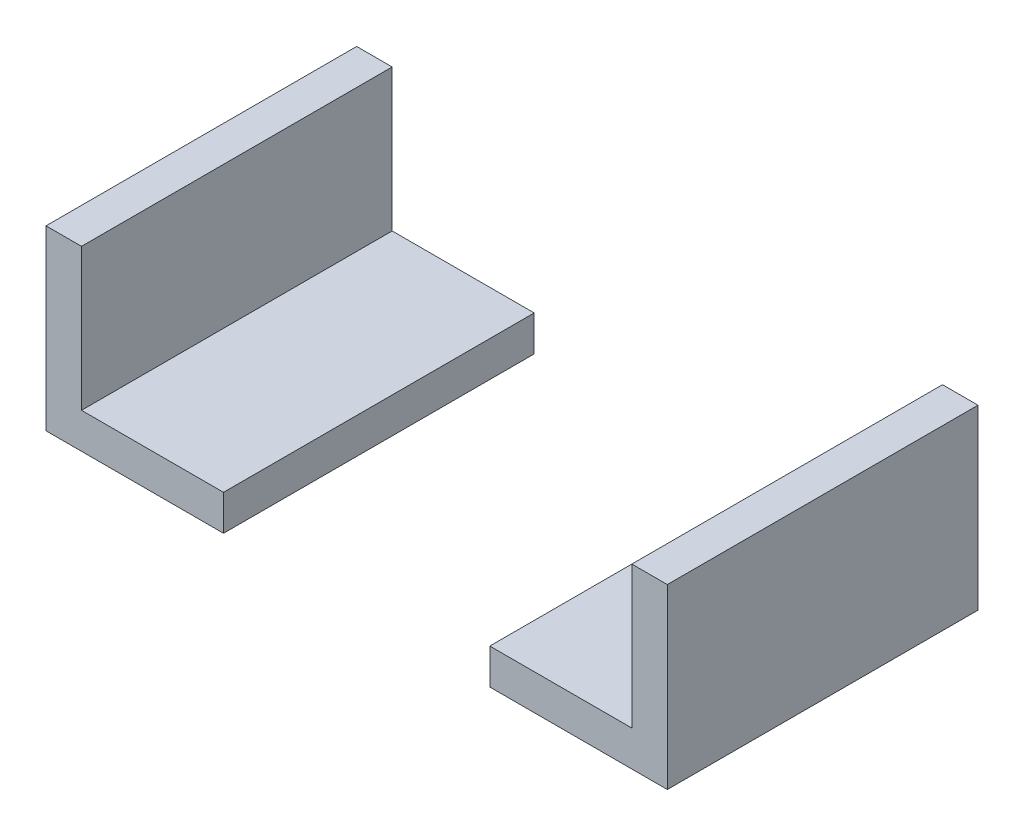
ISO-10303-21;
HEADER;
FILE_DESCRIPTION(('STEP AP214'),'2;1');
FILE_NAME('part.step','',(''),(''),'','','');
FILE_SCHEMA(('AUTOMOTIVE_DESIGN { 1 0 10303 214 1 1 1 1 }'));
ENDSEC;
DATA;
#1=APPLICATION_CONTEXT('core data for automotive mechanical design processes');
#2=APPLICATION_PROTOCOL_DEFINITION('international standard','automotive_design',2000,#1);
#3=PRODUCT_CONTEXT('',#1,'mechanical');
#4=PRODUCT('Part','Part','',(#3));
#5=PRODUCT_RELATED_PRODUCT_CATEGORY('part','',(#4));
#6=PRODUCT_DEFINITION_FORMATION('','',#4);
#7=PRODUCT_DEFINITION_CONTEXT('part definition',#1,'design');
#8=PRODUCT_DEFINITION('design','',#6,#7);
#9=PRODUCT_DEFINITION_SHAPE('','',#8);
#10=(LENGTH_UNIT() NAMED_UNIT(*) SI_UNIT(.MILLI.,.METRE.));
#11=(NAMED_UNIT(*) PLANE_ANGLE_UNIT() SI_UNIT($,.RADIAN.));
#12=(NAMED_UNIT(*) SI_UNIT($,.STERADIAN.) SOLID_ANGLE_UNIT());
#13=UNCERTAINTY_MEASURE_WITH_UNIT(LENGTH_MEASURE(1.E-05),#10,'distance_accuracy_value','');
#14=(GEOMETRIC_REPRESENTATION_CONTEXT(3) GLOBAL_UNCERTAINTY_ASSIGNED_CONTEXT((#13)) GLOBAL_UNIT_ASSIGNED_CONTEXT((#10,
#11,#12)) REPRESENTATION_CONTEXT('',''));
#15=CARTESIAN_POINT('',(0.,0.,0.));
#16=DIRECTION('',(0.,0.,1.));
#17=DIRECTION('',(1.,0.,0.));
#18=AXIS2_PLACEMENT_3D('',#15,#16,#17);
#19=CARTESIAN_POINT('',(89.5823182173414,-16.8988864998088,70.));
#20=DIRECTION('',(0.,1.,0.));
#21=DIRECTION('',(0.,0.,1.));
#22=AXIS2_PLACEMENT_3D('',#19,#20,#21);
#23=PLANE('',#22);
#24=DIRECTION('',(1.,0.,0.));
#25=VECTOR('',#24,1.);
#26=CARTESIAN_POINT('',(89.5823182173414,-16.8988864998088,0.));
#27=LINE('',#26,#25);
#28=CARTESIAN_POINT('',(89.5823182173414,-16.8988864998088,0.));
#29=VERTEX_POINT('',#28);
#30=CARTESIAN_POINT('',(129.582318217341,-16.8988864998088,0.));
#31=VERTEX_POINT('',#30);
#32=EDGE_CURVE('E12',#29,#31,#27,.T.);
#33=ORIENTED_EDGE('',*,*,#32,.T.);
#34=DIRECTION('',(0.,0.,-1.));
#35=VECTOR('',#34,1.);
#36=CARTESIAN_POINT('',(129.582318217341,-16.8988864998088,70.));
#37=LINE('',#36,#35);
#38=CARTESIAN_POINT('',(129.582318217341,-16.8988864998088,70.));
#39=VERTEX_POINT('',#38);
#40=EDGE_CURVE('E151',#39,#31,#37,.T.);
#41=ORIENTED_EDGE('',*,*,#40,.F.);
#42=DIRECTION('',(1.,0.,0.));
#43=VECTOR('',#42,1.);
#44=CARTESIAN_POINT('',(89.5823182173414,-16.8988864998088,70.));
#45=LINE('',#44,#43);
#46=CARTESIAN_POINT('',(89.5823182173414,-16.8988864998088,70.));
#47=VERTEX_POINT('',#46);
#48=EDGE_CURVE('E53',#47,#39,#45,.T.);
#49=ORIENTED_EDGE('',*,*,#48,.F.);
#50=DIRECTION('',(0.,0.,-1.));
#51=VECTOR('',#50,1.);
#52=CARTESIAN_POINT('',(89.5823182173414,-16.8988864998088,70.));
#53=LINE('',#52,#51);
#54=EDGE_CURVE('E139',#47,#29,#53,.T.);
#55=ORIENTED_EDGE('',*,*,#54,.T.);
#56=EDGE_LOOP('',(#33,#41,#49,#55));
#57=FACE_BOUND('',#56,.T.);
#58=ADVANCED_FACE('F49',(#57),#23,.F.);
#59=CARTESIAN_POINT('',(129.582318217341,-16.8988864998088,70.));
#60=DIRECTION('',(-1.,0.,0.));
#61=DIRECTION('',(0.,0.,1.));
#62=AXIS2_PLACEMENT_3D('',#59,#60,#61);
#63=PLANE('',#62);
#64=DIRECTION('',(0.,1.,0.));
#65=VECTOR('',#64,1.);
#66=CARTESIAN_POINT('',(129.582318217341,-16.8988864998088,0.));
#67=LINE('',#66,#65);
#68=CARTESIAN_POINT('',(129.582318217341,23.1011135001912,0.));
#69=VERTEX_POINT('',#68);
#70=EDGE_CURVE('E59',#31,#69,#67,.T.);
#71=ORIENTED_EDGE('',*,*,#70,.T.);
#72=DIRECTION('',(0.,0.,-1.));
#73=VECTOR('',#72,1.);
#74=CARTESIAN_POINT('',(129.582318217341,23.1011135001912,70.));
#75=LINE('',#74,#73);
#76=CARTESIAN_POINT('',(129.582318217341,23.1011135001912,70.));
#77=VERTEX_POINT('',#76);
#78=EDGE_CURVE('E117',#77,#69,#75,.T.);
#79=ORIENTED_EDGE('',*,*,#78,.F.);
#80=DIRECTION('',(0.,1.,0.));
#81=VECTOR('',#80,1.);
#82=CARTESIAN_POINT('',(129.582318217341,-16.8988864998088,70.));
#83=LINE('',#82,#81);
#84=EDGE_CURVE('E89',#39,#77,#83,.T.);
#85=ORIENTED_EDGE('',*,*,#84,.F.);
#86=ORIENTED_EDGE('',*,*,#40,.T.);
#87=EDGE_LOOP('',(#71,#79,#85,#86));
#88=FACE_BOUND('',#87,.T.);
#89=ADVANCED_FACE('F190',(#88),#63,.F.);
#90=CARTESIAN_POINT('',(129.582318217341,23.1011135001912,70.));
#91=DIRECTION('',(0.,-1.,0.));
#92=DIRECTION('',(0.,0.,-1.));
#93=AXIS2_PLACEMENT_3D('',#90,#91,#92);
#94=PLANE('',#93);
#95=DIRECTION('',(-1.,0.,0.));
#96=VECTOR('',#95,1.);
#97=CARTESIAN_POINT('',(129.582318217341,23.1011135001912,0.));
#98=LINE('',#97,#96);
#99=CARTESIAN_POINT('',(121.582318217341,23.1011135001912,0.));
#100=VERTEX_POINT('',#99);
#101=EDGE_CURVE('E111',#69,#100,#98,.T.);
#102=ORIENTED_EDGE('',*,*,#101,.T.);
#103=DIRECTION('',(0.,0.,-1.));
#104=VECTOR('',#103,1.);
#105=CARTESIAN_POINT('',(121.582318217341,23.1011135001912,70.));
#106=LINE('',#105,#104);
#107=CARTESIAN_POINT('',(121.582318217341,23.1011135001912,70.));
#108=VERTEX_POINT('',#107);
#109=EDGE_CURVE('E115',#108,#100,#106,.T.);
#110=ORIENTED_EDGE('',*,*,#109,.F.);
#111=DIRECTION('',(-1.,0.,0.));
#112=VECTOR('',#111,1.);
#113=CARTESIAN_POINT('',(129.582318217341,23.1011135001912,70.));
#114=LINE('',#113,#112);
#115=EDGE_CURVE('E142',#77,#108,#114,.T.);
#116=ORIENTED_EDGE('',*,*,#115,.F.);
#117=ORIENTED_EDGE('',*,*,#78,.T.);
#118=EDGE_LOOP('',(#102,#110,#116,#117));
#119=FACE_BOUND('',#118,.T.);
#120=ADVANCED_FACE('F113',(#119),#94,.F.);
#121=CARTESIAN_POINT('',(121.582318217341,23.1011135001912,70.));
#122=DIRECTION('',(1.,0.,0.));
#123=DIRECTION('',(0.,1.,0.));
#124=AXIS2_PLACEMENT_3D('',#121,#122,#123);
#125=PLANE('',#124);
#126=DIRECTION('',(0.,-1.,0.));
#127=VECTOR('',#126,1.);
#128=CARTESIAN_POINT('',(121.582318217341,23.1011135001912,0.));
#129=LINE('',#128,#127);
#130=CARTESIAN_POINT('',(121.582318217341,-8.89888649980875,0.));
#131=VERTEX_POINT('',#130);
#132=EDGE_CURVE('E119',#100,#131,#129,.T.);
#133=ORIENTED_EDGE('',*,*,#132,.T.);
#134=DIRECTION('',(0.,0.,-1.));
#135=VECTOR('',#134,1.);
#136=CARTESIAN_POINT('',(121.582318217341,-8.89888649980875,70.));
#137=LINE('',#136,#135);
#138=CARTESIAN_POINT('',(121.582318217341,-8.89888649980875,70.));
#139=VERTEX_POINT('',#138);
#140=EDGE_CURVE('E126',#139,#131,#137,.T.);
#141=ORIENTED_EDGE('',*,*,#140,.F.);
#142=DIRECTION('',(0.,-1.,0.));
#143=VECTOR('',#142,1.);
#144=CARTESIAN_POINT('',(121.582318217341,23.1011135001912,70.));
#145=LINE('',#144,#143);
#146=EDGE_CURVE('E125',#108,#139,#145,.T.);
#147=ORIENTED_EDGE('',*,*,#146,.F.);
#148=ORIENTED_EDGE('',*,*,#109,.T.);
#149=EDGE_LOOP('',(#133,#141,#147,#148));
#150=FACE_BOUND('',#149,.T.);
#151=ADVANCED_FACE('F122',(#150),#125,.F.);
#152=CARTESIAN_POINT('',(121.582318217341,-8.89888649980875,70.));
#153=DIRECTION('',(0.,-1.,0.));
#154=DIRECTION('',(0.,0.,-1.));
#155=AXIS2_PLACEMENT_3D('',#152,#153,#154);
#156=PLANE('',#155);
#157=DIRECTION('',(-1.,0.,0.));
#158=VECTOR('',#157,1.);
#159=CARTESIAN_POINT('',(121.582318217341,-8.89888649980875,0.));
#160=LINE('',#159,#158);
#161=CARTESIAN_POINT('',(89.5823182173414,-8.89888649980875,0.));
#162=VERTEX_POINT('',#161);
#163=EDGE_CURVE('E130',#131,#162,#160,.T.);
#164=ORIENTED_EDGE('',*,*,#163,.T.);
#165=DIRECTION('',(0.,0.,-1.));
#166=VECTOR('',#165,1.);
#167=CARTESIAN_POINT('',(89.5823182173414,-8.89888649980875,70.));
#168=LINE('',#167,#166);
#169=CARTESIAN_POINT('',(89.5823182173414,-8.89888649980875,70.));
#170=VERTEX_POINT('',#169);
#171=EDGE_CURVE('E147',#170,#162,#168,.T.);
#172=ORIENTED_EDGE('',*,*,#171,.F.);
#173=DIRECTION('',(-1.,0.,0.));
#174=VECTOR('',#173,1.);
#175=CARTESIAN_POINT('',(121.582318217341,-8.89888649980875,70.));
#176=LINE('',#175,#174);
#177=EDGE_CURVE('E138',#139,#170,#176,.T.);
#178=ORIENTED_EDGE('',*,*,#177,.F.);
#179=ORIENTED_EDGE('',*,*,#140,.T.);
#180=EDGE_LOOP('',(#164,#172,#178,#179));
#181=FACE_BOUND('',#180,.T.);
#182=ADVANCED_FACE('F202',(#181),#156,.F.);
#183=CARTESIAN_POINT('',(89.5823182173414,-8.89888649980875,70.));
#184=DIRECTION('',(1.,0.,0.));
#185=DIRECTION('',(0.,0.,-1.));
#186=AXIS2_PLACEMENT_3D('',#183,#184,#185);
#187=PLANE('',#186);
#188=DIRECTION('',(0.,-1.,0.));
#189=VECTOR('',#188,1.);
#190=CARTESIAN_POINT('',(89.5823182173414,-8.89888649980875,0.));
#191=LINE('',#190,#189);
#192=EDGE_CURVE('E100',#162,#29,#191,.T.);
#193=ORIENTED_EDGE('',*,*,#192,.T.);
#194=ORIENTED_EDGE('',*,*,#54,.F.);
#195=DIRECTION('',(0.,-1.,0.));
#196=VECTOR('',#195,1.);
#197=CARTESIAN_POINT('',(89.5823182173414,-8.89888649980875,70.));
#198=LINE('',#197,#196);
#199=EDGE_CURVE('E136',#170,#47,#198,.T.);
#200=ORIENTED_EDGE('',*,*,#199,.F.);
#201=ORIENTED_EDGE('',*,*,#171,.T.);
#202=EDGE_LOOP('',(#193,#194,#200,#201));
#203=FACE_BOUND('',#202,.T.);
#204=ADVANCED_FACE('F205',(#203),#187,.F.);
#205=CARTESIAN_POINT('',(0.,0.,70.));
#206=DIRECTION('',(0.,0.,1.));
#207=DIRECTION('',(1.,0.,0.));
#208=AXIS2_PLACEMENT_3D('',#205,#206,#207);
#209=PLANE('',#208);
#210=ORIENTED_EDGE('',*,*,#48,.T.);
#211=ORIENTED_EDGE('',*,*,#84,.T.);
#212=ORIENTED_EDGE('',*,*,#115,.T.);
#213=ORIENTED_EDGE('',*,*,#146,.T.);
#214=ORIENTED_EDGE('',*,*,#177,.T.);
#215=ORIENTED_EDGE('',*,*,#199,.T.);
#216=EDGE_LOOP('',(#210,#211,#212,#213,#214,#215));
#217=FACE_BOUND('',#216,.T.);
#218=ADVANCED_FACE('F51',(#217),#209,.T.);
#219=CARTESIAN_POINT('',(0.,0.,0.));
#220=DIRECTION('',(0.,0.,1.));
#221=DIRECTION('',(1.,0.,0.));
#222=AXIS2_PLACEMENT_3D('',#219,#220,#221);
#223=PLANE('',#222);
#224=CARTESIAN_POINT('',(125.582318217341,2.10111350019124,0.));
#225=DIRECTION('',(0.,0.,-1.));
#226=DIRECTION('',(-1.,0.,0.));
#227=AXIS2_PLACEMENT_3D('',#224,#225,#226);
#228=CIRCLE('',#227,2.15);
#229=CARTESIAN_POINT('',(123.432318217341,2.10111350019124,0.));
#230=VERTEX_POINT('',#229);
#231=EDGE_CURVE('E160',#230,#230,#228,.T.);
#232=ORIENTED_EDGE('',*,*,#231,.F.);
#233=EDGE_LOOP('',(#232));
#234=FACE_BOUND('',#233,.T.);
#235=CARTESIAN_POINT('',(115.582318217341,-12.8988864998088,0.));
#236=DIRECTION('',(0.,0.,-1.));
#237=DIRECTION('',(-1.,0.,0.));
#238=AXIS2_PLACEMENT_3D('',#235,#236,#237);
#239=CIRCLE('',#238,2.15);
#240=CARTESIAN_POINT('',(113.432318217341,-12.8988864998088,0.));
#241=VERTEX_POINT('',#240);
#242=EDGE_CURVE('E157',#241,#241,#239,.T.);
#243=ORIENTED_EDGE('',*,*,#242,.F.);
#244=EDGE_LOOP('',(#243));
#245=FACE_BOUND('',#244,.T.);
#246=ORIENTED_EDGE('',*,*,#32,.F.);
#247=ORIENTED_EDGE('',*,*,#192,.F.);
#248=ORIENTED_EDGE('',*,*,#163,.F.);
#249=ORIENTED_EDGE('',*,*,#132,.F.);
#250=ORIENTED_EDGE('',*,*,#101,.F.);
#251=ORIENTED_EDGE('',*,*,#70,.F.);
#252=EDGE_LOOP('',(#246,#247,#248,#249,#250,#251));
#253=FACE_BOUND('',#252,.T.);
#254=ADVANCED_FACE('F129',(#234,#245,#253),#223,.F.);
#255=CARTESIAN_POINT('',(115.582318217341,-12.8988864998088,5.5));
#256=DIRECTION('',(0.,0.,-1.));
#257=DIRECTION('',(-1.,0.,0.));
#258=AXIS2_PLACEMENT_3D('',#255,#256,#257);
#259=CYLINDRICAL_SURFACE('',#258,2.15);
#260=CARTESIAN_POINT('',(115.582318217341,-12.8988864998088,5.5));
#261=DIRECTION('',(0.,0.,-1.));
#262=DIRECTION('',(-1.,0.,0.));
#263=AXIS2_PLACEMENT_3D('',#260,#261,#262);
#264=CIRCLE('',#263,2.15);
#265=CARTESIAN_POINT('',(113.432318217341,-12.8988864998088,5.5));
#266=VERTEX_POINT('',#265);
#267=EDGE_CURVE('E154',#266,#266,#264,.T.);
#268=ORIENTED_EDGE('',*,*,#267,.F.);
#269=EDGE_LOOP('',(#268));
#270=FACE_BOUND('',#269,.T.);
#271=ORIENTED_EDGE('',*,*,#242,.T.);
#272=EDGE_LOOP('',(#271));
#273=FACE_BOUND('',#272,.T.);
#274=ADVANCED_FACE('F177',(#270,#273),#259,.F.);
#275=CARTESIAN_POINT('',(115.582318217341,-12.8988864998088,5.5));
#276=DIRECTION('',(0.,0.,-1.));
#277=DIRECTION('',(-1.,0.,0.));
#278=AXIS2_PLACEMENT_3D('',#275,#276,#277);
#279=PLANE('',#278);
#280=ORIENTED_EDGE('',*,*,#267,.T.);
#281=EDGE_LOOP('',(#280));
#282=FACE_BOUND('',#281,.T.);
#283=ADVANCED_FACE('F171',(#282),#279,.T.);
#284=CARTESIAN_POINT('',(125.582318217341,2.10111350019124,5.5));
#285=DIRECTION('',(0.,0.,-1.));
#286=DIRECTION('',(-1.,0.,0.));
#287=AXIS2_PLACEMENT_3D('',#284,#285,#286);
#288=CYLINDRICAL_SURFACE('',#287,2.15);
#289=CARTESIAN_POINT('',(125.582318217341,2.10111350019124,5.5));
#290=DIRECTION('',(0.,0.,-1.));
#291=DIRECTION('',(-1.,0.,0.));
#292=AXIS2_PLACEMENT_3D('',#289,#290,#291);
#293=CIRCLE('',#292,2.15);
#294=CARTESIAN_POINT('',(123.432318217341,2.10111350019124,5.5));
#295=VERTEX_POINT('',#294);
#296=EDGE_CURVE('E153',#295,#295,#293,.T.);
#297=ORIENTED_EDGE('',*,*,#296,.F.);
#298=EDGE_LOOP('',(#297));
#299=FACE_BOUND('',#298,.T.);
#300=ORIENTED_EDGE('',*,*,#231,.T.);
#301=EDGE_LOOP('',(#300));
#302=FACE_BOUND('',#301,.T.);
#303=ADVANCED_FACE('F168',(#299,#302),#288,.F.);
#304=CARTESIAN_POINT('',(125.582318217341,2.10111350019124,5.5));
#305=DIRECTION('',(0.,0.,-1.));
#306=DIRECTION('',(-1.,0.,0.));
#307=AXIS2_PLACEMENT_3D('',#304,#305,#306);
#308=PLANE('',#307);
#309=ORIENTED_EDGE('',*,*,#296,.T.);
#310=EDGE_LOOP('',(#309));
#311=FACE_BOUND('',#310,.T.);
#312=ADVANCED_FACE('F166',(#311),#308,.T.);
#313=CLOSED_SHELL('',(#58,#89,#120,#151,#182,#204,#218,#254,#274,#283,#303,#312));
#314=MANIFOLD_SOLID_BREP('B2',#313);
#315=CARTESIAN_POINT('',(-10.4176817826586,-16.8988864998088,70.));
#316=DIRECTION('',(1.,0.,0.));
#317=DIRECTION('',(0.,0.,-1.));
#318=AXIS2_PLACEMENT_3D('',#315,#316,#317);
#319=PLANE('',#318);
#320=DIRECTION('',(0.,-1.,0.));
#321=VECTOR('',#320,1.);
#322=CARTESIAN_POINT('',(-10.4176817826586,-16.8988864998088,0.));
#323=LINE('',#322,#321);
#324=CARTESIAN_POINT('',(-10.4176817826586,23.1011135001912,0.));
#325=VERTEX_POINT('',#324);
#326=CARTESIAN_POINT('',(-10.4176817826586,-16.8988864998088,0.));
#327=VERTEX_POINT('',#326);
#328=EDGE_CURVE('E369',#325,#327,#323,.T.);
#329=ORIENTED_EDGE('',*,*,#328,.T.);
#330=DIRECTION('',(0.,0.,-1.));
#331=VECTOR('',#330,1.);
#332=CARTESIAN_POINT('',(-10.4176817826586,-16.8988864998088,70.));
#333=LINE('',#332,#331);
#334=CARTESIAN_POINT('',(-10.4176817826586,-16.8988864998088,70.));
#335=VERTEX_POINT('',#334);
#336=EDGE_CURVE('E47',#335,#327,#333,.T.);
#337=ORIENTED_EDGE('',*,*,#336,.F.);
#338=DIRECTION('',(0.,-1.,0.));
#339=VECTOR('',#338,1.);
#340=CARTESIAN_POINT('',(-10.4176817826586,-16.8988864998088,70.));
#341=LINE('',#340,#339);
#342=CARTESIAN_POINT('',(-10.4176817826586,23.1011135001912,70.));
#343=VERTEX_POINT('',#342);
#344=EDGE_CURVE('E380',#343,#335,#341,.T.);
#345=ORIENTED_EDGE('',*,*,#344,.F.);
#346=DIRECTION('',(0.,0.,-1.));
#347=VECTOR('',#346,1.);
#348=CARTESIAN_POINT('',(-10.4176817826586,23.1011135001912,70.));
#349=LINE('',#348,#347);
#350=EDGE_CURVE('E365',#343,#325,#349,.T.);
#351=ORIENTED_EDGE('',*,*,#350,.T.);
#352=EDGE_LOOP('',(#329,#337,#345,#351));
#353=FACE_BOUND('',#352,.T.);
#354=ADVANCED_FACE('F285',(#353),#319,.F.);
#355=CARTESIAN_POINT('',(29.5823182173414,-16.8988864998088,70.));
#356=DIRECTION('',(0.,1.,0.));
#357=DIRECTION('',(0.,0.,1.));
#358=AXIS2_PLACEMENT_3D('',#355,#356,#357);
#359=PLANE('',#358);
#360=DIRECTION('',(1.,0.,0.));
#361=VECTOR('',#360,1.);
#362=CARTESIAN_POINT('',(29.5823182173414,-16.8988864998088,0.));
#363=LINE('',#362,#361);
#364=CARTESIAN_POINT('',(29.5823182173414,-16.8988864998088,0.));
#365=VERTEX_POINT('',#364);
#366=EDGE_CURVE('E372',#327,#365,#363,.T.);
#367=ORIENTED_EDGE('',*,*,#366,.T.);
#368=DIRECTION('',(0.,0.,-1.));
#369=VECTOR('',#368,1.);
#370=CARTESIAN_POINT('',(29.5823182173414,-16.8988864998088,70.));
#371=LINE('',#370,#369);
#372=CARTESIAN_POINT('',(29.5823182173414,-16.8988864998088,70.));
#373=VERTEX_POINT('',#372);
#374=EDGE_CURVE('E293',#373,#365,#371,.T.);
#375=ORIENTED_EDGE('',*,*,#374,.F.);
#376=DIRECTION('',(1.,0.,0.));
#377=VECTOR('',#376,1.);
#378=CARTESIAN_POINT('',(29.5823182173414,-16.8988864998088,70.));
#379=LINE('',#378,#377);
#380=EDGE_CURVE('E338',#335,#373,#379,.T.);
#381=ORIENTED_EDGE('',*,*,#380,.F.);
#382=ORIENTED_EDGE('',*,*,#336,.T.);
#383=EDGE_LOOP('',(#367,#375,#381,#382));
#384=FACE_BOUND('',#383,.T.);
#385=ADVANCED_FACE('F404',(#384),#359,.F.);
#386=CARTESIAN_POINT('',(29.5823182173414,-8.89888649980875,70.));
#387=DIRECTION('',(-1.,0.,0.));
#388=DIRECTION('',(0.,0.,1.));
#389=AXIS2_PLACEMENT_3D('',#386,#387,#388);
#390=PLANE('',#389);
#391=DIRECTION('',(0.,1.,0.));
#392=VECTOR('',#391,1.);
#393=CARTESIAN_POINT('',(29.5823182173414,-8.89888649980875,0.));
#394=LINE('',#393,#392);
#395=CARTESIAN_POINT('',(29.5823182173414,-8.89888649980875,0.));
#396=VERTEX_POINT('',#395);
#397=EDGE_CURVE('E375',#365,#396,#394,.T.);
#398=ORIENTED_EDGE('',*,*,#397,.T.);
#399=DIRECTION('',(0.,0.,-1.));
#400=VECTOR('',#399,1.);
#401=CARTESIAN_POINT('',(29.5823182173414,-8.89888649980875,70.));
#402=LINE('',#401,#400);
#403=CARTESIAN_POINT('',(29.5823182173414,-8.89888649980875,70.));
#404=VERTEX_POINT('',#403);
#405=EDGE_CURVE('E360',#404,#396,#402,.T.);
#406=ORIENTED_EDGE('',*,*,#405,.F.);
#407=DIRECTION('',(0.,1.,0.));
#408=VECTOR('',#407,1.);
#409=CARTESIAN_POINT('',(29.5823182173414,-8.89888649980875,70.));
#410=LINE('',#409,#408);
#411=EDGE_CURVE('E351',#373,#404,#410,.T.);
#412=ORIENTED_EDGE('',*,*,#411,.F.);
#413=ORIENTED_EDGE('',*,*,#374,.T.);
#414=EDGE_LOOP('',(#398,#406,#412,#413));
#415=FACE_BOUND('',#414,.T.);
#416=ADVANCED_FACE('F386',(#415),#390,.F.);
#417=CARTESIAN_POINT('',(-2.41768178265858,-8.89888649980875,70.));
#418=DIRECTION('',(0.,-1.,0.));
#419=DIRECTION('',(0.,0.,-1.));
#420=AXIS2_PLACEMENT_3D('',#417,#418,#419);
#421=PLANE('',#420);
#422=DIRECTION('',(-1.,0.,0.));
#423=VECTOR('',#422,1.);
#424=CARTESIAN_POINT('',(-2.41768178265858,-8.89888649980875,0.));
#425=LINE('',#424,#423);
#426=CARTESIAN_POINT('',(-2.41768178265858,-8.89888649980875,0.));
#427=VERTEX_POINT('',#426);
#428=EDGE_CURVE('E359',#396,#427,#425,.T.);
#429=ORIENTED_EDGE('',*,*,#428,.T.);
#430=DIRECTION('',(0.,0.,-1.));
#431=VECTOR('',#430,1.);
#432=CARTESIAN_POINT('',(-2.41768178265858,-8.89888649980875,70.));
#433=LINE('',#432,#431);
#434=CARTESIAN_POINT('',(-2.41768178265858,-8.89888649980875,70.));
#435=VERTEX_POINT('',#434);
#436=EDGE_CURVE('E356',#435,#427,#433,.T.);
#437=ORIENTED_EDGE('',*,*,#436,.F.);
#438=DIRECTION('',(-1.,0.,0.));
#439=VECTOR('',#438,1.);
#440=CARTESIAN_POINT('',(-2.41768178265858,-8.89888649980875,70.));
#441=LINE('',#440,#439);
#442=EDGE_CURVE('E345',#404,#435,#441,.T.);
#443=ORIENTED_EDGE('',*,*,#442,.F.);
#444=ORIENTED_EDGE('',*,*,#405,.T.);
#445=EDGE_LOOP('',(#429,#437,#443,#444));
#446=FACE_BOUND('',#445,.T.);
#447=ADVANCED_FACE('F357',(#446),#421,.F.);
#448=CARTESIAN_POINT('',(-2.41768178265858,23.1011135001912,70.));
#449=DIRECTION('',(-1.,0.,0.));
#450=DIRECTION('',(0.,-1.,0.));
#451=AXIS2_PLACEMENT_3D('',#448,#449,#450);
#452=PLANE('',#451);
#453=DIRECTION('',(0.,1.,0.));
#454=VECTOR('',#453,1.);
#455=CARTESIAN_POINT('',(-2.41768178265858,23.1011135001912,0.));
#456=LINE('',#455,#454);
#457=CARTESIAN_POINT('',(-2.41768178265858,23.1011135001912,0.));
#458=VERTEX_POINT('',#457);
#459=EDGE_CURVE('E324',#427,#458,#456,.T.);
#460=ORIENTED_EDGE('',*,*,#459,.T.);
#461=DIRECTION('',(0.,0.,-1.));
#462=VECTOR('',#461,1.);
#463=CARTESIAN_POINT('',(-2.41768178265858,23.1011135001912,70.));
#464=LINE('',#463,#462);
#465=CARTESIAN_POINT('',(-2.41768178265858,23.1011135001912,70.));
#466=VERTEX_POINT('',#465);
#467=EDGE_CURVE('E361',#466,#458,#464,.T.);
#468=ORIENTED_EDGE('',*,*,#467,.F.);
#469=DIRECTION('',(0.,1.,0.));
#470=VECTOR('',#469,1.);
#471=CARTESIAN_POINT('',(-2.41768178265858,23.1011135001912,70.));
#472=LINE('',#471,#470);
#473=EDGE_CURVE('E349',#435,#466,#472,.T.);
#474=ORIENTED_EDGE('',*,*,#473,.F.);
#475=ORIENTED_EDGE('',*,*,#436,.T.);
#476=EDGE_LOOP('',(#460,#468,#474,#475));
#477=FACE_BOUND('',#476,.T.);
#478=ADVANCED_FACE('F363',(#477),#452,.F.);
#479=CARTESIAN_POINT('',(-10.4176817826586,23.1011135001912,70.));
#480=DIRECTION('',(0.,-1.,0.));
#481=DIRECTION('',(0.,0.,-1.));
#482=AXIS2_PLACEMENT_3D('',#479,#480,#481);
#483=PLANE('',#482);
#484=DIRECTION('',(-1.,0.,0.));
#485=VECTOR('',#484,1.);
#486=CARTESIAN_POINT('',(-10.4176817826586,23.1011135001912,0.));
#487=LINE('',#486,#485);
#488=EDGE_CURVE('E330',#458,#325,#487,.T.);
#489=ORIENTED_EDGE('',*,*,#488,.T.);
#490=ORIENTED_EDGE('',*,*,#350,.F.);
#491=DIRECTION('',(-1.,0.,0.));
#492=VECTOR('',#491,1.);
#493=CARTESIAN_POINT('',(-10.4176817826586,23.1011135001912,70.));
#494=LINE('',#493,#492);
#495=EDGE_CURVE('E301',#466,#343,#494,.T.);
#496=ORIENTED_EDGE('',*,*,#495,.F.);
#497=ORIENTED_EDGE('',*,*,#467,.T.);
#498=EDGE_LOOP('',(#489,#490,#496,#497));
#499=FACE_BOUND('',#498,.T.);
#500=ADVANCED_FACE('F393',(#499),#483,.F.);
#501=CARTESIAN_POINT('',(0.,0.,70.));
#502=DIRECTION('',(0.,0.,-1.));
#503=DIRECTION('',(-1.,0.,0.));
#504=AXIS2_PLACEMENT_3D('',#501,#502,#503);
#505=PLANE('',#504);
#506=ORIENTED_EDGE('',*,*,#344,.T.);
#507=ORIENTED_EDGE('',*,*,#380,.T.);
#508=ORIENTED_EDGE('',*,*,#411,.T.);
#509=ORIENTED_EDGE('',*,*,#442,.T.);
#510=ORIENTED_EDGE('',*,*,#473,.T.);
#511=ORIENTED_EDGE('',*,*,#495,.T.);
#512=EDGE_LOOP('',(#506,#507,#508,#509,#510,#511));
#513=FACE_BOUND('',#512,.T.);
#514=ADVANCED_FACE('F347',(#513),#505,.F.);
#515=CARTESIAN_POINT('',(0.,0.,0.));
#516=DIRECTION('',(0.,0.,-1.));
#517=DIRECTION('',(-1.,0.,0.));
#518=AXIS2_PLACEMENT_3D('',#515,#516,#517);
#519=PLANE('',#518);
#520=CARTESIAN_POINT('',(3.5823182173414,-12.8988864998088,0.));
#521=DIRECTION('',(0.,0.,-1.));
#522=DIRECTION('',(1.,0.,0.));
#523=AXIS2_PLACEMENT_3D('',#520,#521,#522);
#524=CIRCLE('',#523,2.15);
#525=CARTESIAN_POINT('',(5.7323182173414,-12.8988864998088,0.));
#526=VERTEX_POINT('',#525);
#527=EDGE_CURVE('E373',#526,#526,#524,.T.);
#528=ORIENTED_EDGE('',*,*,#527,.F.);
#529=EDGE_LOOP('',(#528));
#530=FACE_BOUND('',#529,.T.);
#531=CARTESIAN_POINT('',(-6.41768178265859,2.10111350019124,0.));
#532=DIRECTION('',(0.,0.,-1.));
#533=DIRECTION('',(1.,0.,0.));
#534=AXIS2_PLACEMENT_3D('',#531,#532,#533);
#535=CIRCLE('',#534,2.15);
#536=CARTESIAN_POINT('',(-4.26768178265859,2.10111350019124,0.));
#537=VERTEX_POINT('',#536);
#538=EDGE_CURVE('E488',#537,#537,#535,.T.);
#539=ORIENTED_EDGE('',*,*,#538,.F.);
#540=EDGE_LOOP('',(#539));
#541=FACE_BOUND('',#540,.T.);
#542=ORIENTED_EDGE('',*,*,#328,.F.);
#543=ORIENTED_EDGE('',*,*,#488,.F.);
#544=ORIENTED_EDGE('',*,*,#459,.F.);
#545=ORIENTED_EDGE('',*,*,#428,.F.);
#546=ORIENTED_EDGE('',*,*,#397,.F.);
#547=ORIENTED_EDGE('',*,*,#366,.F.);
#548=EDGE_LOOP('',(#542,#543,#544,#545,#546,#547));
#549=FACE_BOUND('',#548,.T.);
#550=ADVANCED_FACE('F389',(#530,#541,#549),#519,.T.);
#551=CARTESIAN_POINT('',(-6.41768178265859,2.10111350019124,5.5));
#552=DIRECTION('',(0.,0.,-1.));
#553=DIRECTION('',(-1.,0.,0.));
#554=AXIS2_PLACEMENT_3D('',#551,#552,#553);
#555=CYLINDRICAL_SURFACE('',#554,2.15);
#556=CARTESIAN_POINT('',(-6.41768178265859,2.10111350019124,5.5));
#557=DIRECTION('',(0.,0.,-1.));
#558=DIRECTION('',(1.,0.,0.));
#559=AXIS2_PLACEMENT_3D('',#556,#557,#558);
#560=CIRCLE('',#559,2.15);
#561=CARTESIAN_POINT('',(-4.26768178265859,2.10111350019124,5.5));
#562=VERTEX_POINT('',#561);
#563=EDGE_CURVE('E493',#562,#562,#560,.T.);
#564=ORIENTED_EDGE('',*,*,#563,.F.);
#565=EDGE_LOOP('',(#564));
#566=FACE_BOUND('',#565,.T.);
#567=ORIENTED_EDGE('',*,*,#538,.T.);
#568=EDGE_LOOP('',(#567));
#569=FACE_BOUND('',#568,.T.);
#570=ADVANCED_FACE('F443',(#566,#569),#555,.F.);
#571=CARTESIAN_POINT('',(-6.41768178265859,2.10111350019124,5.5));
#572=DIRECTION('',(0.,0.,1.));
#573=DIRECTION('',(1.,0.,0.));
#574=AXIS2_PLACEMENT_3D('',#571,#572,#573);
#575=PLANE('',#574);
#576=ORIENTED_EDGE('',*,*,#563,.T.);
#577=EDGE_LOOP('',(#576));
#578=FACE_BOUND('',#577,.T.);
#579=ADVANCED_FACE('F452',(#578),#575,.F.);
#580=CARTESIAN_POINT('',(3.5823182173414,-12.8988864998088,5.5));
#581=DIRECTION('',(0.,0.,-1.));
#582=DIRECTION('',(-1.,0.,0.));
#583=AXIS2_PLACEMENT_3D('',#580,#581,#582);
#584=CYLINDRICAL_SURFACE('',#583,2.15);
#585=CARTESIAN_POINT('',(3.5823182173414,-12.8988864998088,5.5));
#586=DIRECTION('',(0.,0.,-1.));
#587=DIRECTION('',(1.,0.,0.));
#588=AXIS2_PLACEMENT_3D('',#585,#586,#587);
#589=CIRCLE('',#588,2.15);
#590=CARTESIAN_POINT('',(5.7323182173414,-12.8988864998088,5.5));
#591=VERTEX_POINT('',#590);
#592=EDGE_CURVE('E487',#591,#591,#589,.T.);
#593=ORIENTED_EDGE('',*,*,#592,.F.);
#594=EDGE_LOOP('',(#593));
#595=FACE_BOUND('',#594,.T.);
#596=ORIENTED_EDGE('',*,*,#527,.T.);
#597=EDGE_LOOP('',(#596));
#598=FACE_BOUND('',#597,.T.);
#599=ADVANCED_FACE('F462',(#595,#598),#584,.F.);
#600=CARTESIAN_POINT('',(3.5823182173414,-12.8988864998088,5.5));
#601=DIRECTION('',(0.,0.,1.));
#602=DIRECTION('',(1.,0.,0.));
#603=AXIS2_PLACEMENT_3D('',#600,#601,#602);
#604=PLANE('',#603);
#605=ORIENTED_EDGE('',*,*,#592,.T.);
#606=EDGE_LOOP('',(#605));
#607=FACE_BOUND('',#606,.T.);
#608=ADVANCED_FACE('F472',(#607),#604,.F.);
#609=CLOSED_SHELL('',(#354,#385,#416,#447,#478,#500,#514,#550,#570,#579,#599,#608));
#610=MANIFOLD_SOLID_BREP('B6',#609);
#611=ADVANCED_BREP_SHAPE_REPRESENTATION('',(#18,#314,#610),#14);
#612=SHAPE_DEFINITION_REPRESENTATION(#9,#611);
ENDSEC;
END-ISO-10303-21;
